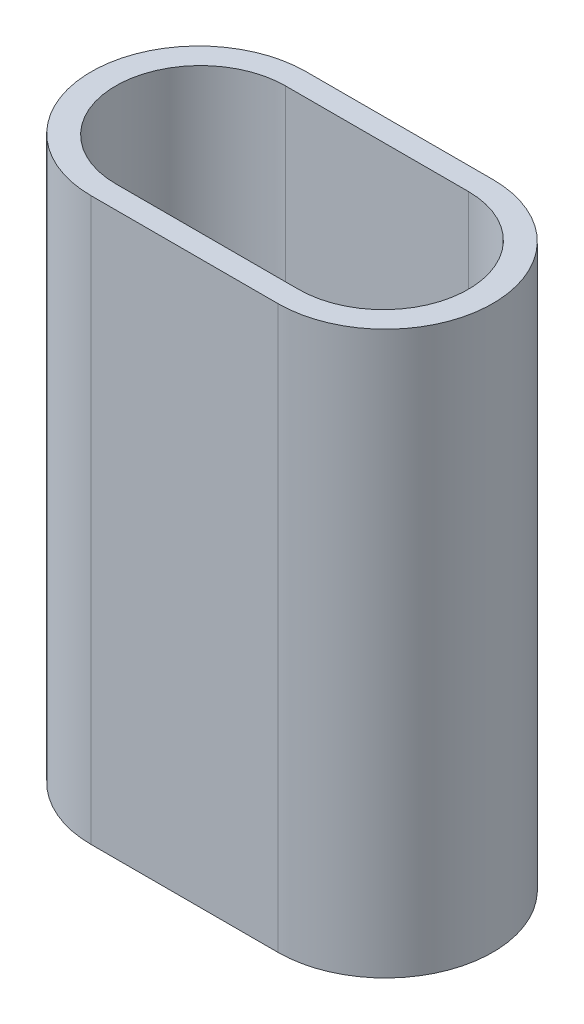
ISO-10303-21;
HEADER;
FILE_DESCRIPTION(('STEP AP214'),'2;1');
FILE_NAME('part.step','',(''),(''),'','','');
FILE_SCHEMA(('AUTOMOTIVE_DESIGN { 1 0 10303 214 1 1 1 1 }'));
ENDSEC;
DATA;
#1=APPLICATION_CONTEXT('core data for automotive mechanical design processes');
#2=APPLICATION_PROTOCOL_DEFINITION('international standard','automotive_design',2000,#1);
#3=PRODUCT_CONTEXT('',#1,'mechanical');
#4=PRODUCT('Part','Part','',(#3));
#5=PRODUCT_RELATED_PRODUCT_CATEGORY('part','',(#4));
#6=PRODUCT_DEFINITION_FORMATION('','',#4);
#7=PRODUCT_DEFINITION_CONTEXT('part definition',#1,'design');
#8=PRODUCT_DEFINITION('design','',#6,#7);
#9=PRODUCT_DEFINITION_SHAPE('','',#8);
#10=(LENGTH_UNIT() NAMED_UNIT(*) SI_UNIT(.MILLI.,.METRE.));
#11=(NAMED_UNIT(*) PLANE_ANGLE_UNIT() SI_UNIT($,.RADIAN.));
#12=(NAMED_UNIT(*) SI_UNIT($,.STERADIAN.) SOLID_ANGLE_UNIT());
#13=UNCERTAINTY_MEASURE_WITH_UNIT(LENGTH_MEASURE(1.E-05),#10,'distance_accuracy_value','');
#14=(GEOMETRIC_REPRESENTATION_CONTEXT(3) GLOBAL_UNCERTAINTY_ASSIGNED_CONTEXT((#13)) GLOBAL_UNIT_ASSIGNED_CONTEXT((#10,
#11,#12)) REPRESENTATION_CONTEXT('',''));
#15=CARTESIAN_POINT('',(0.,0.,0.));
#16=DIRECTION('',(0.,0.,1.));
#17=DIRECTION('',(1.,0.,0.));
#18=AXIS2_PLACEMENT_3D('',#15,#16,#17);
#19=CARTESIAN_POINT('',(0.,14.9,0.));
#20=DIRECTION('',(0.,-1.,0.));
#21=DIRECTION('',(0.,0.,-1.));
#22=AXIS2_PLACEMENT_3D('',#19,#20,#21);
#23=CYLINDRICAL_SURFACE('',#22,2.25);
#24=DIRECTION('',(0.,-1.,0.));
#25=VECTOR('',#24,1.);
#26=CARTESIAN_POINT('',(0.,14.9,2.25));
#27=LINE('',#26,#25);
#28=CARTESIAN_POINT('',(0.,0.8,2.25));
#29=VERTEX_POINT('',#28);
#30=CARTESIAN_POINT('',(0.,0.,2.25));
#31=VERTEX_POINT('',#30);
#32=EDGE_CURVE('E210',#29,#31,#27,.T.);
#33=ORIENTED_EDGE('',*,*,#32,.F.);
#34=CARTESIAN_POINT('',(0.,0.8,0.));
#35=DIRECTION('',(0.,1.,0.));
#36=DIRECTION('',(0.,0.,1.));
#37=AXIS2_PLACEMENT_3D('',#34,#35,#36);
#38=CIRCLE('',#37,2.25);
#39=CARTESIAN_POINT('',(0.,0.8,-2.25));
#40=VERTEX_POINT('',#39);
#41=EDGE_CURVE('E170',#29,#40,#38,.T.);
#42=ORIENTED_EDGE('',*,*,#41,.T.);
#43=DIRECTION('',(0.,-1.,0.));
#44=VECTOR('',#43,1.);
#45=CARTESIAN_POINT('',(0.,14.9,-2.25));
#46=LINE('',#45,#44);
#47=CARTESIAN_POINT('',(0.,0.,-2.25));
#48=VERTEX_POINT('',#47);
#49=EDGE_CURVE('E166',#40,#48,#46,.T.);
#50=ORIENTED_EDGE('',*,*,#49,.T.);
#51=CARTESIAN_POINT('',(0.,0.,0.));
#52=DIRECTION('',(0.,-1.,0.));
#53=DIRECTION('',(0.,0.,-1.));
#54=AXIS2_PLACEMENT_3D('',#51,#52,#53);
#55=CIRCLE('',#54,2.25);
#56=EDGE_CURVE('E190',#48,#31,#55,.T.);
#57=ORIENTED_EDGE('',*,*,#56,.T.);
#58=EDGE_LOOP('',(#33,#42,#50,#57));
#59=FACE_BOUND('',#58,.T.);
#60=ADVANCED_FACE('F23',(#59),#23,.F.);
#61=CARTESIAN_POINT('',(-2.425,0.8,0.));
#62=DIRECTION('',(0.,1.,0.));
#63=DIRECTION('',(1.,0.,0.));
#64=AXIS2_PLACEMENT_3D('',#61,#62,#63);
#65=PLANE('',#64);
#66=CARTESIAN_POINT('',(0.,0.8,0.));
#67=DIRECTION('',(0.,1.,0.));
#68=DIRECTION('',(0.,0.,1.));
#69=AXIS2_PLACEMENT_3D('',#66,#67,#68);
#70=CIRCLE('',#69,2.25);
#71=EDGE_CURVE('E221',#40,#29,#70,.T.);
#72=ORIENTED_EDGE('',*,*,#71,.F.);
#73=DIRECTION('',(-1.,0.,0.));
#74=VECTOR('',#73,1.);
#75=CARTESIAN_POINT('',(-2.425,0.8,-2.25));
#76=LINE('',#75,#74);
#77=CARTESIAN_POINT('',(-2.425,0.8,-2.25));
#78=VERTEX_POINT('',#77);
#79=EDGE_CURVE('E48',#40,#78,#76,.T.);
#80=ORIENTED_EDGE('',*,*,#79,.T.);
#81=CARTESIAN_POINT('',(-2.425,0.8,0.));
#82=DIRECTION('',(0.,1.,0.));
#83=DIRECTION('',(0.,0.,1.));
#84=AXIS2_PLACEMENT_3D('',#81,#82,#83);
#85=CIRCLE('',#84,2.25);
#86=CARTESIAN_POINT('',(-2.425,0.8,2.25));
#87=VERTEX_POINT('',#86);
#88=EDGE_CURVE('E27',#78,#87,#85,.T.);
#89=ORIENTED_EDGE('',*,*,#88,.T.);
#90=DIRECTION('',(1.,0.,0.));
#91=VECTOR('',#90,1.);
#92=CARTESIAN_POINT('',(-2.425,0.8,2.25));
#93=LINE('',#92,#91);
#94=EDGE_CURVE('E13',#87,#29,#93,.T.);
#95=ORIENTED_EDGE('',*,*,#94,.T.);
#96=EDGE_LOOP('',(#72,#80,#89,#95));
#97=FACE_BOUND('',#96,.T.);
#98=ADVANCED_FACE('F260',(#97),#65,.T.);
#99=CARTESIAN_POINT('',(-2.425,0.8,2.25));
#100=DIRECTION('',(0.,0.,1.));
#101=DIRECTION('',(1.,0.,0.));
#102=AXIS2_PLACEMENT_3D('',#99,#100,#101);
#103=PLANE('',#102);
#104=DIRECTION('',(1.,0.,0.));
#105=VECTOR('',#104,1.);
#106=CARTESIAN_POINT('',(-2.425,14.9,2.25));
#107=LINE('',#106,#105);
#108=CARTESIAN_POINT('',(-2.425,14.9,2.25));
#109=VERTEX_POINT('',#108);
#110=CARTESIAN_POINT('',(2.425,14.9,2.25));
#111=VERTEX_POINT('',#110);
#112=EDGE_CURVE('E228',#109,#111,#107,.T.);
#113=ORIENTED_EDGE('',*,*,#112,.T.);
#114=DIRECTION('',(0.,1.,0.));
#115=VECTOR('',#114,1.);
#116=CARTESIAN_POINT('',(2.425,0.8,2.25));
#117=LINE('',#116,#115);
#118=CARTESIAN_POINT('',(2.425,0.8,2.25));
#119=VERTEX_POINT('',#118);
#120=EDGE_CURVE('E34',#119,#111,#117,.T.);
#121=ORIENTED_EDGE('',*,*,#120,.F.);
#122=DIRECTION('',(1.,0.,0.));
#123=VECTOR('',#122,1.);
#124=CARTESIAN_POINT('',(-2.425,0.8,2.25));
#125=LINE('',#124,#123);
#126=EDGE_CURVE('E172',#29,#119,#125,.T.);
#127=ORIENTED_EDGE('',*,*,#126,.F.);
#128=ORIENTED_EDGE('',*,*,#94,.F.);
#129=DIRECTION('',(0.,1.,0.));
#130=VECTOR('',#129,1.);
#131=CARTESIAN_POINT('',(-2.425,0.8,2.25));
#132=LINE('',#131,#130);
#133=EDGE_CURVE('E186',#87,#109,#132,.T.);
#134=ORIENTED_EDGE('',*,*,#133,.T.);
#135=EDGE_LOOP('',(#113,#121,#127,#128,#134));
#136=FACE_BOUND('',#135,.T.);
#137=ADVANCED_FACE('F268',(#136),#103,.F.);
#138=CARTESIAN_POINT('',(2.425,0.8,0.));
#139=DIRECTION('',(0.,1.,0.));
#140=DIRECTION('',(0.,0.,1.));
#141=AXIS2_PLACEMENT_3D('',#138,#139,#140);
#142=CYLINDRICAL_SURFACE('',#141,2.25);
#143=CARTESIAN_POINT('',(2.425,14.9,0.));
#144=DIRECTION('',(0.,1.,0.));
#145=DIRECTION('',(0.,0.,1.));
#146=AXIS2_PLACEMENT_3D('',#143,#144,#145);
#147=CIRCLE('',#146,2.25);
#148=CARTESIAN_POINT('',(2.425,14.9,-2.25));
#149=VERTEX_POINT('',#148);
#150=EDGE_CURVE('E185',#111,#149,#147,.T.);
#151=ORIENTED_EDGE('',*,*,#150,.T.);
#152=DIRECTION('',(0.,1.,0.));
#153=VECTOR('',#152,1.);
#154=CARTESIAN_POINT('',(2.425,0.8,-2.25));
#155=LINE('',#154,#153);
#156=CARTESIAN_POINT('',(2.425,0.8,-2.25));
#157=VERTEX_POINT('',#156);
#158=EDGE_CURVE('E206',#157,#149,#155,.T.);
#159=ORIENTED_EDGE('',*,*,#158,.F.);
#160=CARTESIAN_POINT('',(2.425,0.8,0.));
#161=DIRECTION('',(0.,1.,0.));
#162=DIRECTION('',(0.,0.,1.));
#163=AXIS2_PLACEMENT_3D('',#160,#161,#162);
#164=CIRCLE('',#163,2.25);
#165=EDGE_CURVE('E176',#119,#157,#164,.T.);
#166=ORIENTED_EDGE('',*,*,#165,.F.);
#167=ORIENTED_EDGE('',*,*,#120,.T.);
#168=EDGE_LOOP('',(#151,#159,#166,#167));
#169=FACE_BOUND('',#168,.T.);
#170=ADVANCED_FACE('F267',(#169),#142,.F.);
#171=CARTESIAN_POINT('',(-2.425,0.8,-2.25));
#172=DIRECTION('',(0.,0.,-1.));
#173=DIRECTION('',(0.,-1.,0.));
#174=AXIS2_PLACEMENT_3D('',#171,#172,#173);
#175=PLANE('',#174);
#176=DIRECTION('',(-1.,0.,0.));
#177=VECTOR('',#176,1.);
#178=CARTESIAN_POINT('',(-2.425,14.9,-2.25));
#179=LINE('',#178,#177);
#180=CARTESIAN_POINT('',(-2.425,14.9,-2.25));
#181=VERTEX_POINT('',#180);
#182=EDGE_CURVE('E181',#149,#181,#179,.T.);
#183=ORIENTED_EDGE('',*,*,#182,.T.);
#184=DIRECTION('',(0.,1.,0.));
#185=VECTOR('',#184,1.);
#186=CARTESIAN_POINT('',(-2.425,0.8,-2.25));
#187=LINE('',#186,#185);
#188=EDGE_CURVE('E159',#78,#181,#187,.T.);
#189=ORIENTED_EDGE('',*,*,#188,.F.);
#190=ORIENTED_EDGE('',*,*,#79,.F.);
#191=DIRECTION('',(-1.,0.,0.));
#192=VECTOR('',#191,1.);
#193=CARTESIAN_POINT('',(-2.425,0.8,-2.25));
#194=LINE('',#193,#192);
#195=EDGE_CURVE('E217',#157,#40,#194,.T.);
#196=ORIENTED_EDGE('',*,*,#195,.F.);
#197=ORIENTED_EDGE('',*,*,#158,.T.);
#198=EDGE_LOOP('',(#183,#189,#190,#196,#197));
#199=FACE_BOUND('',#198,.T.);
#200=ADVANCED_FACE('F276',(#199),#175,.F.);
#201=CARTESIAN_POINT('',(-2.425,0.8,0.));
#202=DIRECTION('',(0.,1.,0.));
#203=DIRECTION('',(0.,0.,1.));
#204=AXIS2_PLACEMENT_3D('',#201,#202,#203);
#205=CYLINDRICAL_SURFACE('',#204,2.25);
#206=CARTESIAN_POINT('',(-2.425,14.9,0.));
#207=DIRECTION('',(0.,1.,0.));
#208=DIRECTION('',(0.,0.,1.));
#209=AXIS2_PLACEMENT_3D('',#206,#207,#208);
#210=CIRCLE('',#209,2.25);
#211=EDGE_CURVE('E136',#181,#109,#210,.T.);
#212=ORIENTED_EDGE('',*,*,#211,.T.);
#213=ORIENTED_EDGE('',*,*,#133,.F.);
#214=ORIENTED_EDGE('',*,*,#88,.F.);
#215=ORIENTED_EDGE('',*,*,#188,.T.);
#216=EDGE_LOOP('',(#212,#213,#214,#215));
#217=FACE_BOUND('',#216,.T.);
#218=ADVANCED_FACE('F273',(#217),#205,.F.);
#219=CARTESIAN_POINT('',(-2.475,0.,0.));
#220=DIRECTION('',(0.,1.,0.));
#221=DIRECTION('',(1.,0.,0.));
#222=AXIS2_PLACEMENT_3D('',#219,#220,#221);
#223=PLANE('',#222);
#224=ORIENTED_EDGE('',*,*,#56,.F.);
#225=CARTESIAN_POINT('',(0.,0.,0.));
#226=DIRECTION('',(0.,-1.,0.));
#227=DIRECTION('',(0.,0.,-1.));
#228=AXIS2_PLACEMENT_3D('',#225,#226,#227);
#229=CIRCLE('',#228,2.25);
#230=EDGE_CURVE('E171',#31,#48,#229,.T.);
#231=ORIENTED_EDGE('',*,*,#230,.F.);
#232=EDGE_LOOP('',(#224,#231));
#233=FACE_BOUND('',#232,.T.);
#234=CARTESIAN_POINT('',(-2.475,0.,0.));
#235=DIRECTION('',(0.,1.,0.));
#236=DIRECTION('',(0.,0.,1.));
#237=AXIS2_PLACEMENT_3D('',#234,#235,#236);
#238=CIRCLE('',#237,2.85);
#239=CARTESIAN_POINT('',(-2.475,0.,-2.85));
#240=VERTEX_POINT('',#239);
#241=CARTESIAN_POINT('',(-2.475,0.,2.85));
#242=VERTEX_POINT('',#241);
#243=EDGE_CURVE('E155',#240,#242,#238,.T.);
#244=ORIENTED_EDGE('',*,*,#243,.F.);
#245=DIRECTION('',(-1.,0.,0.));
#246=VECTOR('',#245,1.);
#247=CARTESIAN_POINT('',(-2.475,0.,-2.85));
#248=LINE('',#247,#246);
#249=CARTESIAN_POINT('',(2.475,0.,-2.85));
#250=VERTEX_POINT('',#249);
#251=EDGE_CURVE('E137',#250,#240,#248,.T.);
#252=ORIENTED_EDGE('',*,*,#251,.F.);
#253=CARTESIAN_POINT('',(2.475,0.,0.));
#254=DIRECTION('',(0.,1.,0.));
#255=DIRECTION('',(0.,0.,1.));
#256=AXIS2_PLACEMENT_3D('',#253,#254,#255);
#257=CIRCLE('',#256,2.85);
#258=CARTESIAN_POINT('',(2.475,0.,2.85));
#259=VERTEX_POINT('',#258);
#260=EDGE_CURVE('E163',#259,#250,#257,.T.);
#261=ORIENTED_EDGE('',*,*,#260,.F.);
#262=DIRECTION('',(1.,0.,0.));
#263=VECTOR('',#262,1.);
#264=CARTESIAN_POINT('',(-2.475,0.,2.85));
#265=LINE('',#264,#263);
#266=EDGE_CURVE('E146',#242,#259,#265,.T.);
#267=ORIENTED_EDGE('',*,*,#266,.F.);
#268=EDGE_LOOP('',(#244,#252,#261,#267));
#269=FACE_BOUND('',#268,.T.);
#270=ADVANCED_FACE('F431',(#233,#269),#223,.F.);
#271=CARTESIAN_POINT('',(-2.475,14.9,0.));
#272=DIRECTION('',(0.,1.,0.));
#273=DIRECTION('',(1.,0.,0.));
#274=AXIS2_PLACEMENT_3D('',#271,#272,#273);
#275=PLANE('',#274);
#276=ORIENTED_EDGE('',*,*,#211,.F.);
#277=ORIENTED_EDGE('',*,*,#182,.F.);
#278=ORIENTED_EDGE('',*,*,#150,.F.);
#279=ORIENTED_EDGE('',*,*,#112,.F.);
#280=EDGE_LOOP('',(#276,#277,#278,#279));
#281=FACE_BOUND('',#280,.T.);
#282=CARTESIAN_POINT('',(-2.475,14.9,0.));
#283=DIRECTION('',(0.,1.,0.));
#284=DIRECTION('',(0.,0.,1.));
#285=AXIS2_PLACEMENT_3D('',#282,#283,#284);
#286=CIRCLE('',#285,2.85);
#287=CARTESIAN_POINT('',(-2.475,14.9,-2.85));
#288=VERTEX_POINT('',#287);
#289=CARTESIAN_POINT('',(-2.475,14.9,2.85));
#290=VERTEX_POINT('',#289);
#291=EDGE_CURVE('E129',#288,#290,#286,.T.);
#292=ORIENTED_EDGE('',*,*,#291,.T.);
#293=DIRECTION('',(1.,0.,0.));
#294=VECTOR('',#293,1.);
#295=CARTESIAN_POINT('',(-2.475,14.9,2.85));
#296=LINE('',#295,#294);
#297=CARTESIAN_POINT('',(2.475,14.9,2.85));
#298=VERTEX_POINT('',#297);
#299=EDGE_CURVE('E161',#290,#298,#296,.T.);
#300=ORIENTED_EDGE('',*,*,#299,.T.);
#301=CARTESIAN_POINT('',(2.475,14.9,0.));
#302=DIRECTION('',(0.,1.,0.));
#303=DIRECTION('',(0.,0.,1.));
#304=AXIS2_PLACEMENT_3D('',#301,#302,#303);
#305=CIRCLE('',#304,2.85);
#306=CARTESIAN_POINT('',(2.475,14.9,-2.85));
#307=VERTEX_POINT('',#306);
#308=EDGE_CURVE('E131',#298,#307,#305,.T.);
#309=ORIENTED_EDGE('',*,*,#308,.T.);
#310=DIRECTION('',(-1.,0.,0.));
#311=VECTOR('',#310,1.);
#312=CARTESIAN_POINT('',(-2.475,14.9,-2.85));
#313=LINE('',#312,#311);
#314=EDGE_CURVE('E124',#307,#288,#313,.T.);
#315=ORIENTED_EDGE('',*,*,#314,.T.);
#316=EDGE_LOOP('',(#292,#300,#309,#315));
#317=FACE_BOUND('',#316,.T.);
#318=ADVANCED_FACE('F126',(#281,#317),#275,.T.);
#319=CARTESIAN_POINT('',(-2.475,14.9,-2.85));
#320=DIRECTION('',(0.,0.,1.));
#321=DIRECTION('',(1.,0.,0.));
#322=AXIS2_PLACEMENT_3D('',#319,#320,#321);
#323=PLANE('',#322);
#324=ORIENTED_EDGE('',*,*,#251,.T.);
#325=DIRECTION('',(0.,-1.,0.));
#326=VECTOR('',#325,1.);
#327=CARTESIAN_POINT('',(-2.475,14.9,-2.85));
#328=LINE('',#327,#326);
#329=EDGE_CURVE('E140',#288,#240,#328,.T.);
#330=ORIENTED_EDGE('',*,*,#329,.F.);
#331=ORIENTED_EDGE('',*,*,#314,.F.);
#332=DIRECTION('',(0.,-1.,0.));
#333=VECTOR('',#332,1.);
#334=CARTESIAN_POINT('',(2.475,14.9,-2.85));
#335=LINE('',#334,#333);
#336=EDGE_CURVE('E180',#307,#250,#335,.T.);
#337=ORIENTED_EDGE('',*,*,#336,.T.);
#338=EDGE_LOOP('',(#324,#330,#331,#337));
#339=FACE_BOUND('',#338,.T.);
#340=ADVANCED_FACE('F141',(#339),#323,.F.);
#341=CARTESIAN_POINT('',(2.475,14.9,0.));
#342=DIRECTION('',(0.,-1.,0.));
#343=DIRECTION('',(0.,0.,-1.));
#344=AXIS2_PLACEMENT_3D('',#341,#342,#343);
#345=CYLINDRICAL_SURFACE('',#344,2.85);
#346=ORIENTED_EDGE('',*,*,#260,.T.);
#347=ORIENTED_EDGE('',*,*,#336,.F.);
#348=ORIENTED_EDGE('',*,*,#308,.F.);
#349=DIRECTION('',(0.,-1.,0.));
#350=VECTOR('',#349,1.);
#351=CARTESIAN_POINT('',(2.475,14.9,2.85));
#352=LINE('',#351,#350);
#353=EDGE_CURVE('E164',#298,#259,#352,.T.);
#354=ORIENTED_EDGE('',*,*,#353,.T.);
#355=EDGE_LOOP('',(#346,#347,#348,#354));
#356=FACE_BOUND('',#355,.T.);
#357=ADVANCED_FACE('F415',(#356),#345,.T.);
#358=CARTESIAN_POINT('',(-2.475,14.9,2.85));
#359=DIRECTION('',(0.,0.,-1.));
#360=DIRECTION('',(0.,-1.,0.));
#361=AXIS2_PLACEMENT_3D('',#358,#359,#360);
#362=PLANE('',#361);
#363=ORIENTED_EDGE('',*,*,#266,.T.);
#364=ORIENTED_EDGE('',*,*,#353,.F.);
#365=ORIENTED_EDGE('',*,*,#299,.F.);
#366=DIRECTION('',(0.,-1.,0.));
#367=VECTOR('',#366,1.);
#368=CARTESIAN_POINT('',(-2.475,14.9,2.85));
#369=LINE('',#368,#367);
#370=EDGE_CURVE('E149',#290,#242,#369,.T.);
#371=ORIENTED_EDGE('',*,*,#370,.T.);
#372=EDGE_LOOP('',(#363,#364,#365,#371));
#373=FACE_BOUND('',#372,.T.);
#374=ADVANCED_FACE('F25',(#373),#362,.F.);
#375=CARTESIAN_POINT('',(-2.475,14.9,0.));
#376=DIRECTION('',(0.,-1.,0.));
#377=DIRECTION('',(0.,0.,-1.));
#378=AXIS2_PLACEMENT_3D('',#375,#376,#377);
#379=CYLINDRICAL_SURFACE('',#378,2.85);
#380=ORIENTED_EDGE('',*,*,#243,.T.);
#381=ORIENTED_EDGE('',*,*,#370,.F.);
#382=ORIENTED_EDGE('',*,*,#291,.F.);
#383=ORIENTED_EDGE('',*,*,#329,.T.);
#384=EDGE_LOOP('',(#380,#381,#382,#383));
#385=FACE_BOUND('',#384,.T.);
#386=ADVANCED_FACE('F147',(#385),#379,.T.);
#387=CARTESIAN_POINT('',(-2.425,0.8,0.));
#388=DIRECTION('',(0.,1.,0.));
#389=DIRECTION('',(1.,0.,0.));
#390=AXIS2_PLACEMENT_3D('',#387,#388,#389);
#391=PLANE('',#390);
#392=ORIENTED_EDGE('',*,*,#41,.F.);
#393=ORIENTED_EDGE('',*,*,#126,.T.);
#394=ORIENTED_EDGE('',*,*,#165,.T.);
#395=ORIENTED_EDGE('',*,*,#195,.T.);
#396=EDGE_LOOP('',(#392,#393,#394,#395));
#397=FACE_BOUND('',#396,.T.);
#398=ADVANCED_FACE('F250',(#397),#391,.T.);
#399=CARTESIAN_POINT('',(0.,14.9,0.));
#400=DIRECTION('',(0.,-1.,0.));
#401=DIRECTION('',(0.,0.,-1.));
#402=AXIS2_PLACEMENT_3D('',#399,#400,#401);
#403=CYLINDRICAL_SURFACE('',#402,2.25);
#404=ORIENTED_EDGE('',*,*,#71,.T.);
#405=ORIENTED_EDGE('',*,*,#32,.T.);
#406=ORIENTED_EDGE('',*,*,#230,.T.);
#407=ORIENTED_EDGE('',*,*,#49,.F.);
#408=EDGE_LOOP('',(#404,#405,#406,#407));
#409=FACE_BOUND('',#408,.T.);
#410=ADVANCED_FACE('F258',(#409),#403,.F.);
#411=CLOSED_SHELL('',(#60,#98,#137,#170,#200,#218,#270,#318,#340,#357,#374,#386,#398,#410));
#412=MANIFOLD_SOLID_BREP('B1',#411);
#413=ADVANCED_BREP_SHAPE_REPRESENTATION('',(#18,#412),#14);
#414=SHAPE_DEFINITION_REPRESENTATION(#9,#413);
ENDSEC;
END-ISO-10303-21;
